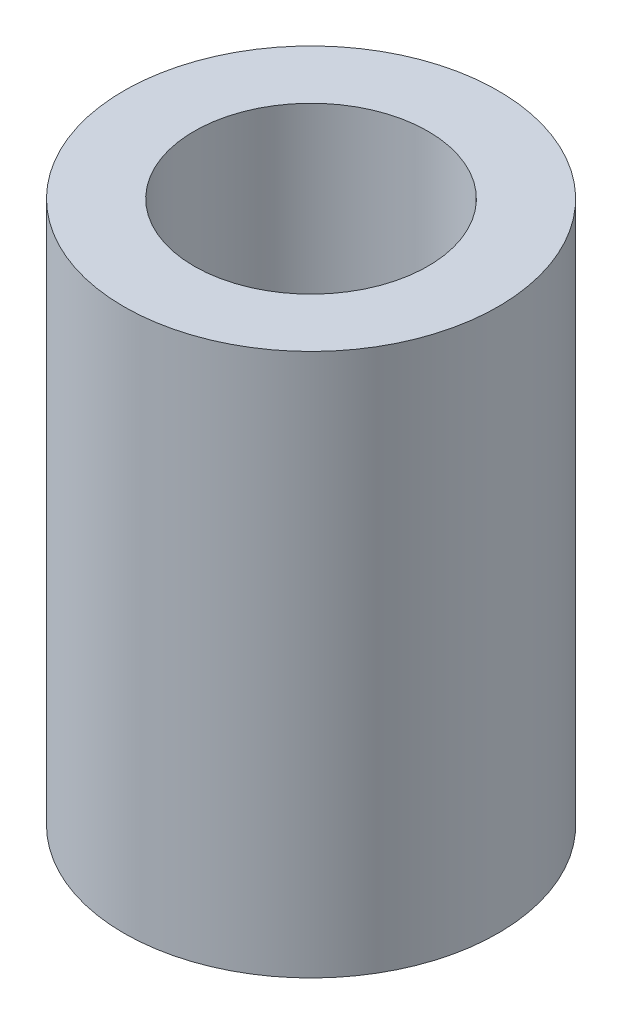
ISO-10303-21;
HEADER;
FILE_DESCRIPTION(('STEP AP214'),'2;1');
FILE_NAME('part.step','',(''),(''),'','','');
FILE_SCHEMA(('AUTOMOTIVE_DESIGN { 1 0 10303 214 1 1 1 1 }'));
ENDSEC;
DATA;
#1=APPLICATION_CONTEXT('core data for automotive mechanical design processes');
#2=APPLICATION_PROTOCOL_DEFINITION('international standard','automotive_design',2000,#1);
#3=PRODUCT_CONTEXT('',#1,'mechanical');
#4=PRODUCT('Part','Part','',(#3));
#5=PRODUCT_RELATED_PRODUCT_CATEGORY('part','',(#4));
#6=PRODUCT_DEFINITION_FORMATION('','',#4);
#7=PRODUCT_DEFINITION_CONTEXT('part definition',#1,'design');
#8=PRODUCT_DEFINITION('design','',#6,#7);
#9=PRODUCT_DEFINITION_SHAPE('','',#8);
#10=(LENGTH_UNIT() NAMED_UNIT(*) SI_UNIT(.MILLI.,.METRE.));
#11=(NAMED_UNIT(*) PLANE_ANGLE_UNIT() SI_UNIT($,.RADIAN.));
#12=(NAMED_UNIT(*) SI_UNIT($,.STERADIAN.) SOLID_ANGLE_UNIT());
#13=UNCERTAINTY_MEASURE_WITH_UNIT(LENGTH_MEASURE(1.E-05),#10,'distance_accuracy_value','');
#14=(GEOMETRIC_REPRESENTATION_CONTEXT(3) GLOBAL_UNCERTAINTY_ASSIGNED_CONTEXT((#13)) GLOBAL_UNIT_ASSIGNED_CONTEXT((#10,
#11,#12)) REPRESENTATION_CONTEXT('',''));
#15=CARTESIAN_POINT('',(0.,0.,0.));
#16=DIRECTION('',(0.,0.,1.));
#17=DIRECTION('',(1.,0.,0.));
#18=AXIS2_PLACEMENT_3D('',#15,#16,#17);
#19=CARTESIAN_POINT('',(0.,29.,0.));
#20=DIRECTION('',(0.,1.,0.));
#21=DIRECTION('',(0.,0.,1.));
#22=AXIS2_PLACEMENT_3D('',#19,#20,#21);
#23=PLANE('',#22);
#24=CARTESIAN_POINT('',(0.,29.,0.));
#25=DIRECTION('',(0.,1.,0.));
#26=DIRECTION('',(0.,0.,1.));
#27=AXIS2_PLACEMENT_3D('',#24,#25,#26);
#28=CIRCLE('',#27,20.);
#29=CARTESIAN_POINT('',(0.,29.,20.));
#30=VERTEX_POINT('',#29);
#31=EDGE_CURVE('E10',#30,#30,#28,.T.);
#32=ORIENTED_EDGE('',*,*,#31,.T.);
#33=EDGE_LOOP('',(#32));
#34=FACE_BOUND('',#33,.T.);
#35=CARTESIAN_POINT('',(0.,29.,0.));
#36=DIRECTION('',(0.,1.,0.));
#37=DIRECTION('',(0.,0.,1.));
#38=AXIS2_PLACEMENT_3D('',#35,#36,#37);
#39=CIRCLE('',#38,12.5);
#40=CARTESIAN_POINT('',(0.,29.,12.5));
#41=VERTEX_POINT('',#40);
#42=EDGE_CURVE('E26',#41,#41,#39,.T.);
#43=ORIENTED_EDGE('',*,*,#42,.F.);
#44=EDGE_LOOP('',(#43));
#45=FACE_BOUND('',#44,.T.);
#46=ADVANCED_FACE('F15',(#34,#45),#23,.T.);
#47=CARTESIAN_POINT('',(0.,-29.,0.));
#48=DIRECTION('',(0.,1.,0.));
#49=DIRECTION('',(0.,0.,1.));
#50=AXIS2_PLACEMENT_3D('',#47,#48,#49);
#51=PLANE('',#50);
#52=CARTESIAN_POINT('',(0.,-29.,0.));
#53=DIRECTION('',(0.,1.,0.));
#54=DIRECTION('',(0.,0.,1.));
#55=AXIS2_PLACEMENT_3D('',#52,#53,#54);
#56=CIRCLE('',#55,20.);
#57=CARTESIAN_POINT('',(0.,-29.,20.));
#58=VERTEX_POINT('',#57);
#59=EDGE_CURVE('E19',#58,#58,#56,.T.);
#60=ORIENTED_EDGE('',*,*,#59,.F.);
#61=EDGE_LOOP('',(#60));
#62=FACE_BOUND('',#61,.T.);
#63=CARTESIAN_POINT('',(0.,-29.,0.));
#64=DIRECTION('',(0.,1.,0.));
#65=DIRECTION('',(0.,0.,1.));
#66=AXIS2_PLACEMENT_3D('',#63,#64,#65);
#67=CIRCLE('',#66,12.5);
#68=CARTESIAN_POINT('',(0.,-29.,12.5));
#69=VERTEX_POINT('',#68);
#70=EDGE_CURVE('E28',#69,#69,#67,.T.);
#71=ORIENTED_EDGE('',*,*,#70,.T.);
#72=EDGE_LOOP('',(#71));
#73=FACE_BOUND('',#72,.T.);
#74=ADVANCED_FACE('F38',(#62,#73),#51,.F.);
#75=CARTESIAN_POINT('',(0.,29.,0.));
#76=DIRECTION('',(0.,-1.,0.));
#77=DIRECTION('',(0.,0.,-1.));
#78=AXIS2_PLACEMENT_3D('',#75,#76,#77);
#79=CYLINDRICAL_SURFACE('',#78,20.);
#80=ORIENTED_EDGE('',*,*,#31,.F.);
#81=EDGE_LOOP('',(#80));
#82=FACE_BOUND('',#81,.T.);
#83=ORIENTED_EDGE('',*,*,#59,.T.);
#84=EDGE_LOOP('',(#83));
#85=FACE_BOUND('',#84,.T.);
#86=ADVANCED_FACE('F17',(#82,#85),#79,.T.);
#87=CARTESIAN_POINT('',(0.,29.,0.));
#88=DIRECTION('',(0.,-1.,0.));
#89=DIRECTION('',(0.,0.,-1.));
#90=AXIS2_PLACEMENT_3D('',#87,#88,#89);
#91=CYLINDRICAL_SURFACE('',#90,12.5);
#92=ORIENTED_EDGE('',*,*,#42,.T.);
#93=EDGE_LOOP('',(#92));
#94=FACE_BOUND('',#93,.T.);
#95=ORIENTED_EDGE('',*,*,#70,.F.);
#96=EDGE_LOOP('',(#95));
#97=FACE_BOUND('',#96,.T.);
#98=ADVANCED_FACE('F34',(#94,#97),#91,.F.);
#99=CLOSED_SHELL('',(#46,#74,#86,#98));
#100=MANIFOLD_SOLID_BREP('B1',#99);
#101=ADVANCED_BREP_SHAPE_REPRESENTATION('',(#18,#100),#14);
#102=SHAPE_DEFINITION_REPRESENTATION(#9,#101);
ENDSEC;
END-ISO-10303-21;
